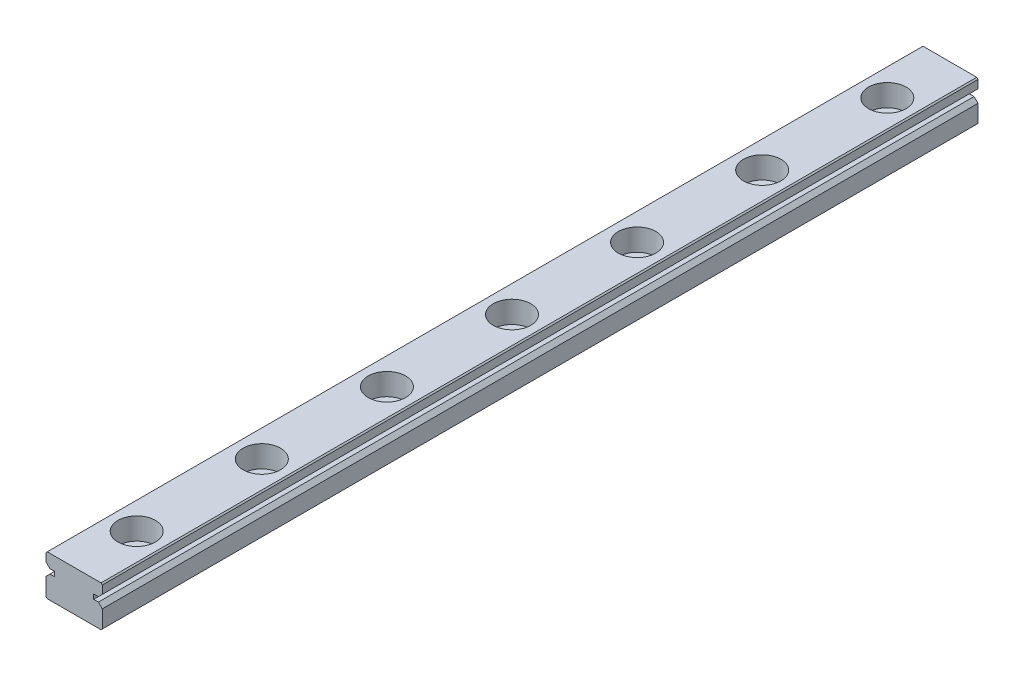
ISO-10303-21;
HEADER;
FILE_DESCRIPTION(('STEP AP214'),'2;1');
FILE_NAME('part.step','',(''),(''),'','','');
FILE_SCHEMA(('AUTOMOTIVE_DESIGN { 1 0 10303 214 1 1 1 1 }'));
ENDSEC;
DATA;
#1=APPLICATION_CONTEXT('core data for automotive mechanical design processes');
#2=APPLICATION_PROTOCOL_DEFINITION('international standard','automotive_design',2000,#1);
#3=PRODUCT_CONTEXT('',#1,'mechanical');
#4=PRODUCT('Part','Part','',(#3));
#5=PRODUCT_RELATED_PRODUCT_CATEGORY('part','',(#4));
#6=PRODUCT_DEFINITION_FORMATION('','',#4);
#7=PRODUCT_DEFINITION_CONTEXT('part definition',#1,'design');
#8=PRODUCT_DEFINITION('design','',#6,#7);
#9=PRODUCT_DEFINITION_SHAPE('','',#8);
#10=(LENGTH_UNIT() NAMED_UNIT(*) SI_UNIT(.MILLI.,.METRE.));
#11=(NAMED_UNIT(*) PLANE_ANGLE_UNIT() SI_UNIT($,.RADIAN.));
#12=(NAMED_UNIT(*) SI_UNIT($,.STERADIAN.) SOLID_ANGLE_UNIT());
#13=UNCERTAINTY_MEASURE_WITH_UNIT(LENGTH_MEASURE(1.E-05),#10,'distance_accuracy_value','');
#14=(GEOMETRIC_REPRESENTATION_CONTEXT(3) GLOBAL_UNCERTAINTY_ASSIGNED_CONTEXT((#13)) GLOBAL_UNIT_ASSIGNED_CONTEXT((#10,
#11,#12)) REPRESENTATION_CONTEXT('',''));
#15=CARTESIAN_POINT('',(0.,0.,0.));
#16=DIRECTION('',(0.,0.,1.));
#17=DIRECTION('',(1.,0.,0.));
#18=AXIS2_PLACEMENT_3D('',#15,#16,#17);
#19=CARTESIAN_POINT('',(0.,6.5,130.));
#20=DIRECTION('',(0.,1.,0.));
#21=DIRECTION('',(0.,0.,1.));
#22=AXIS2_PLACEMENT_3D('',#19,#20,#21);
#23=CYLINDRICAL_SURFACE('',#22,3.);
#24=CARTESIAN_POINT('',(0.,3.,130.));
#25=DIRECTION('',(0.,1.,0.));
#26=DIRECTION('',(0.,0.,1.));
#27=AXIS2_PLACEMENT_3D('',#24,#25,#26);
#28=CIRCLE('',#27,3.);
#29=CARTESIAN_POINT('',(0.,3.,133.));
#30=VERTEX_POINT('',#29);
#31=EDGE_CURVE('E11',#30,#30,#28,.T.);
#32=ORIENTED_EDGE('',*,*,#31,.F.);
#33=EDGE_LOOP('',(#32));
#34=FACE_BOUND('',#33,.T.);
#35=CARTESIAN_POINT('',(0.,6.5,130.));
#36=DIRECTION('',(0.,1.,0.));
#37=DIRECTION('',(0.,0.,1.));
#38=AXIS2_PLACEMENT_3D('',#35,#36,#37);
#39=CIRCLE('',#38,3.);
#40=CARTESIAN_POINT('',(0.,6.5,133.));
#41=VERTEX_POINT('',#40);
#42=EDGE_CURVE('E354',#41,#41,#39,.T.);
#43=ORIENTED_EDGE('',*,*,#42,.T.);
#44=EDGE_LOOP('',(#43));
#45=FACE_BOUND('',#44,.T.);
#46=ADVANCED_FACE('F47',(#34,#45),#23,.F.);
#47=CARTESIAN_POINT('',(1.75,3.,130.));
#48=DIRECTION('',(0.,-1.,0.));
#49=DIRECTION('',(0.,0.,-1.));
#50=AXIS2_PLACEMENT_3D('',#47,#48,#49);
#51=PLANE('',#50);
#52=CARTESIAN_POINT('',(0.,3.,130.));
#53=DIRECTION('',(0.,1.,0.));
#54=DIRECTION('',(0.,0.,1.));
#55=AXIS2_PLACEMENT_3D('',#52,#53,#54);
#56=CIRCLE('',#55,1.75);
#57=CARTESIAN_POINT('',(0.,3.,131.75));
#58=VERTEX_POINT('',#57);
#59=EDGE_CURVE('E55',#58,#58,#56,.T.);
#60=ORIENTED_EDGE('',*,*,#59,.F.);
#61=EDGE_LOOP('',(#60));
#62=FACE_BOUND('',#61,.T.);
#63=ORIENTED_EDGE('',*,*,#31,.T.);
#64=EDGE_LOOP('',(#63));
#65=FACE_BOUND('',#64,.T.);
#66=ADVANCED_FACE('F364',(#62,#65),#51,.F.);
#67=CARTESIAN_POINT('',(0.,6.5,130.));
#68=DIRECTION('',(0.,1.,0.));
#69=DIRECTION('',(0.,0.,1.));
#70=AXIS2_PLACEMENT_3D('',#67,#68,#69);
#71=CYLINDRICAL_SURFACE('',#70,1.75);
#72=CARTESIAN_POINT('',(0.,0.,130.));
#73=DIRECTION('',(0.,1.,0.));
#74=DIRECTION('',(0.,0.,1.));
#75=AXIS2_PLACEMENT_3D('',#72,#73,#74);
#76=CIRCLE('',#75,1.75);
#77=CARTESIAN_POINT('',(0.,0.,131.75));
#78=VERTEX_POINT('',#77);
#79=EDGE_CURVE('E357',#78,#78,#76,.T.);
#80=ORIENTED_EDGE('',*,*,#79,.F.);
#81=EDGE_LOOP('',(#80));
#82=FACE_BOUND('',#81,.T.);
#83=ORIENTED_EDGE('',*,*,#59,.T.);
#84=EDGE_LOOP('',(#83));
#85=FACE_BOUND('',#84,.T.);
#86=ADVANCED_FACE('F362',(#82,#85),#71,.F.);
#87=CARTESIAN_POINT('',(0.,6.5,110.));
#88=DIRECTION('',(0.,1.,0.));
#89=DIRECTION('',(0.,0.,1.));
#90=AXIS2_PLACEMENT_3D('',#87,#88,#89);
#91=CYLINDRICAL_SURFACE('',#90,3.);
#92=CARTESIAN_POINT('',(0.,3.,110.));
#93=DIRECTION('',(0.,1.,0.));
#94=DIRECTION('',(0.,0.,1.));
#95=AXIS2_PLACEMENT_3D('',#92,#93,#94);
#96=CIRCLE('',#95,3.);
#97=CARTESIAN_POINT('',(0.,3.,113.));
#98=VERTEX_POINT('',#97);
#99=EDGE_CURVE('E351',#98,#98,#96,.T.);
#100=ORIENTED_EDGE('',*,*,#99,.F.);
#101=EDGE_LOOP('',(#100));
#102=FACE_BOUND('',#101,.T.);
#103=CARTESIAN_POINT('',(0.,6.5,110.));
#104=DIRECTION('',(0.,1.,0.));
#105=DIRECTION('',(0.,0.,1.));
#106=AXIS2_PLACEMENT_3D('',#103,#104,#105);
#107=CIRCLE('',#106,3.);
#108=CARTESIAN_POINT('',(0.,6.5,113.));
#109=VERTEX_POINT('',#108);
#110=EDGE_CURVE('E342',#109,#109,#107,.T.);
#111=ORIENTED_EDGE('',*,*,#110,.T.);
#112=EDGE_LOOP('',(#111));
#113=FACE_BOUND('',#112,.T.);
#114=ADVANCED_FACE('F471',(#102,#113),#91,.F.);
#115=CARTESIAN_POINT('',(1.75,3.,110.));
#116=DIRECTION('',(0.,-1.,0.));
#117=DIRECTION('',(0.,0.,-1.));
#118=AXIS2_PLACEMENT_3D('',#115,#116,#117);
#119=PLANE('',#118);
#120=CARTESIAN_POINT('',(0.,3.,110.));
#121=DIRECTION('',(0.,1.,0.));
#122=DIRECTION('',(0.,0.,1.));
#123=AXIS2_PLACEMENT_3D('',#120,#121,#122);
#124=CIRCLE('',#123,1.75);
#125=CARTESIAN_POINT('',(0.,3.,111.75));
#126=VERTEX_POINT('',#125);
#127=EDGE_CURVE('E348',#126,#126,#124,.T.);
#128=ORIENTED_EDGE('',*,*,#127,.F.);
#129=EDGE_LOOP('',(#128));
#130=FACE_BOUND('',#129,.T.);
#131=ORIENTED_EDGE('',*,*,#99,.T.);
#132=EDGE_LOOP('',(#131));
#133=FACE_BOUND('',#132,.T.);
#134=ADVANCED_FACE('F467',(#130,#133),#119,.F.);
#135=CARTESIAN_POINT('',(0.,6.5,110.));
#136=DIRECTION('',(0.,1.,0.));
#137=DIRECTION('',(0.,0.,1.));
#138=AXIS2_PLACEMENT_3D('',#135,#136,#137);
#139=CYLINDRICAL_SURFACE('',#138,1.75);
#140=CARTESIAN_POINT('',(0.,0.,110.));
#141=DIRECTION('',(0.,1.,0.));
#142=DIRECTION('',(0.,0.,1.));
#143=AXIS2_PLACEMENT_3D('',#140,#141,#142);
#144=CIRCLE('',#143,1.75);
#145=CARTESIAN_POINT('',(0.,0.,111.75));
#146=VERTEX_POINT('',#145);
#147=EDGE_CURVE('E345',#146,#146,#144,.T.);
#148=ORIENTED_EDGE('',*,*,#147,.F.);
#149=EDGE_LOOP('',(#148));
#150=FACE_BOUND('',#149,.T.);
#151=ORIENTED_EDGE('',*,*,#127,.T.);
#152=EDGE_LOOP('',(#151));
#153=FACE_BOUND('',#152,.T.);
#154=ADVANCED_FACE('F463',(#150,#153),#139,.F.);
#155=CARTESIAN_POINT('',(0.,6.5,90.));
#156=DIRECTION('',(0.,1.,0.));
#157=DIRECTION('',(0.,0.,1.));
#158=AXIS2_PLACEMENT_3D('',#155,#156,#157);
#159=CYLINDRICAL_SURFACE('',#158,3.);
#160=CARTESIAN_POINT('',(0.,3.,90.));
#161=DIRECTION('',(0.,1.,0.));
#162=DIRECTION('',(0.,0.,1.));
#163=AXIS2_PLACEMENT_3D('',#160,#161,#162);
#164=CIRCLE('',#163,3.);
#165=CARTESIAN_POINT('',(0.,3.,93.));
#166=VERTEX_POINT('',#165);
#167=EDGE_CURVE('E339',#166,#166,#164,.T.);
#168=ORIENTED_EDGE('',*,*,#167,.F.);
#169=EDGE_LOOP('',(#168));
#170=FACE_BOUND('',#169,.T.);
#171=CARTESIAN_POINT('',(0.,6.5,90.));
#172=DIRECTION('',(0.,1.,0.));
#173=DIRECTION('',(0.,0.,1.));
#174=AXIS2_PLACEMENT_3D('',#171,#172,#173);
#175=CIRCLE('',#174,3.);
#176=CARTESIAN_POINT('',(0.,6.5,93.));
#177=VERTEX_POINT('',#176);
#178=EDGE_CURVE('E330',#177,#177,#175,.T.);
#179=ORIENTED_EDGE('',*,*,#178,.T.);
#180=EDGE_LOOP('',(#179));
#181=FACE_BOUND('',#180,.T.);
#182=ADVANCED_FACE('F459',(#170,#181),#159,.F.);
#183=CARTESIAN_POINT('',(1.75,3.,90.));
#184=DIRECTION('',(0.,-1.,0.));
#185=DIRECTION('',(0.,0.,-1.));
#186=AXIS2_PLACEMENT_3D('',#183,#184,#185);
#187=PLANE('',#186);
#188=CARTESIAN_POINT('',(0.,3.,90.));
#189=DIRECTION('',(0.,1.,0.));
#190=DIRECTION('',(0.,0.,1.));
#191=AXIS2_PLACEMENT_3D('',#188,#189,#190);
#192=CIRCLE('',#191,1.75);
#193=CARTESIAN_POINT('',(0.,3.,91.75));
#194=VERTEX_POINT('',#193);
#195=EDGE_CURVE('E336',#194,#194,#192,.T.);
#196=ORIENTED_EDGE('',*,*,#195,.F.);
#197=EDGE_LOOP('',(#196));
#198=FACE_BOUND('',#197,.T.);
#199=ORIENTED_EDGE('',*,*,#167,.T.);
#200=EDGE_LOOP('',(#199));
#201=FACE_BOUND('',#200,.T.);
#202=ADVANCED_FACE('F455',(#198,#201),#187,.F.);
#203=CARTESIAN_POINT('',(0.,6.5,90.));
#204=DIRECTION('',(0.,1.,0.));
#205=DIRECTION('',(0.,0.,1.));
#206=AXIS2_PLACEMENT_3D('',#203,#204,#205);
#207=CYLINDRICAL_SURFACE('',#206,1.75);
#208=CARTESIAN_POINT('',(0.,0.,90.));
#209=DIRECTION('',(0.,1.,0.));
#210=DIRECTION('',(0.,0.,1.));
#211=AXIS2_PLACEMENT_3D('',#208,#209,#210);
#212=CIRCLE('',#211,1.75);
#213=CARTESIAN_POINT('',(0.,0.,91.75));
#214=VERTEX_POINT('',#213);
#215=EDGE_CURVE('E333',#214,#214,#212,.T.);
#216=ORIENTED_EDGE('',*,*,#215,.F.);
#217=EDGE_LOOP('',(#216));
#218=FACE_BOUND('',#217,.T.);
#219=ORIENTED_EDGE('',*,*,#195,.T.);
#220=EDGE_LOOP('',(#219));
#221=FACE_BOUND('',#220,.T.);
#222=ADVANCED_FACE('F451',(#218,#221),#207,.F.);
#223=CARTESIAN_POINT('',(0.,6.5,70.));
#224=DIRECTION('',(0.,1.,0.));
#225=DIRECTION('',(0.,0.,1.));
#226=AXIS2_PLACEMENT_3D('',#223,#224,#225);
#227=CYLINDRICAL_SURFACE('',#226,3.);
#228=CARTESIAN_POINT('',(0.,3.,70.));
#229=DIRECTION('',(0.,1.,0.));
#230=DIRECTION('',(0.,0.,1.));
#231=AXIS2_PLACEMENT_3D('',#228,#229,#230);
#232=CIRCLE('',#231,3.);
#233=CARTESIAN_POINT('',(0.,3.,73.));
#234=VERTEX_POINT('',#233);
#235=EDGE_CURVE('E327',#234,#234,#232,.T.);
#236=ORIENTED_EDGE('',*,*,#235,.F.);
#237=EDGE_LOOP('',(#236));
#238=FACE_BOUND('',#237,.T.);
#239=CARTESIAN_POINT('',(0.,6.5,70.));
#240=DIRECTION('',(0.,1.,0.));
#241=DIRECTION('',(0.,0.,1.));
#242=AXIS2_PLACEMENT_3D('',#239,#240,#241);
#243=CIRCLE('',#242,3.);
#244=CARTESIAN_POINT('',(0.,6.5,73.));
#245=VERTEX_POINT('',#244);
#246=EDGE_CURVE('E318',#245,#245,#243,.T.);
#247=ORIENTED_EDGE('',*,*,#246,.T.);
#248=EDGE_LOOP('',(#247));
#249=FACE_BOUND('',#248,.T.);
#250=ADVANCED_FACE('F447',(#238,#249),#227,.F.);
#251=CARTESIAN_POINT('',(1.75,3.,70.));
#252=DIRECTION('',(0.,-1.,0.));
#253=DIRECTION('',(0.,0.,-1.));
#254=AXIS2_PLACEMENT_3D('',#251,#252,#253);
#255=PLANE('',#254);
#256=CARTESIAN_POINT('',(0.,3.,70.));
#257=DIRECTION('',(0.,1.,0.));
#258=DIRECTION('',(0.,0.,1.));
#259=AXIS2_PLACEMENT_3D('',#256,#257,#258);
#260=CIRCLE('',#259,1.75);
#261=CARTESIAN_POINT('',(0.,3.,71.75));
#262=VERTEX_POINT('',#261);
#263=EDGE_CURVE('E324',#262,#262,#260,.T.);
#264=ORIENTED_EDGE('',*,*,#263,.F.);
#265=EDGE_LOOP('',(#264));
#266=FACE_BOUND('',#265,.T.);
#267=ORIENTED_EDGE('',*,*,#235,.T.);
#268=EDGE_LOOP('',(#267));
#269=FACE_BOUND('',#268,.T.);
#270=ADVANCED_FACE('F443',(#266,#269),#255,.F.);
#271=CARTESIAN_POINT('',(0.,6.5,70.));
#272=DIRECTION('',(0.,1.,0.));
#273=DIRECTION('',(0.,0.,1.));
#274=AXIS2_PLACEMENT_3D('',#271,#272,#273);
#275=CYLINDRICAL_SURFACE('',#274,1.75);
#276=CARTESIAN_POINT('',(0.,0.,70.));
#277=DIRECTION('',(0.,1.,0.));
#278=DIRECTION('',(0.,0.,1.));
#279=AXIS2_PLACEMENT_3D('',#276,#277,#278);
#280=CIRCLE('',#279,1.75);
#281=CARTESIAN_POINT('',(0.,0.,71.75));
#282=VERTEX_POINT('',#281);
#283=EDGE_CURVE('E321',#282,#282,#280,.T.);
#284=ORIENTED_EDGE('',*,*,#283,.F.);
#285=EDGE_LOOP('',(#284));
#286=FACE_BOUND('',#285,.T.);
#287=ORIENTED_EDGE('',*,*,#263,.T.);
#288=EDGE_LOOP('',(#287));
#289=FACE_BOUND('',#288,.T.);
#290=ADVANCED_FACE('F439',(#286,#289),#275,.F.);
#291=CARTESIAN_POINT('',(0.,6.5,50.));
#292=DIRECTION('',(0.,1.,0.));
#293=DIRECTION('',(0.,0.,1.));
#294=AXIS2_PLACEMENT_3D('',#291,#292,#293);
#295=CYLINDRICAL_SURFACE('',#294,3.);
#296=CARTESIAN_POINT('',(0.,3.,50.));
#297=DIRECTION('',(0.,1.,0.));
#298=DIRECTION('',(0.,0.,1.));
#299=AXIS2_PLACEMENT_3D('',#296,#297,#298);
#300=CIRCLE('',#299,3.);
#301=CARTESIAN_POINT('',(0.,3.,53.));
#302=VERTEX_POINT('',#301);
#303=EDGE_CURVE('E315',#302,#302,#300,.T.);
#304=ORIENTED_EDGE('',*,*,#303,.F.);
#305=EDGE_LOOP('',(#304));
#306=FACE_BOUND('',#305,.T.);
#307=CARTESIAN_POINT('',(0.,6.5,50.));
#308=DIRECTION('',(0.,1.,0.));
#309=DIRECTION('',(0.,0.,1.));
#310=AXIS2_PLACEMENT_3D('',#307,#308,#309);
#311=CIRCLE('',#310,3.);
#312=CARTESIAN_POINT('',(0.,6.5,53.));
#313=VERTEX_POINT('',#312);
#314=EDGE_CURVE('E306',#313,#313,#311,.T.);
#315=ORIENTED_EDGE('',*,*,#314,.T.);
#316=EDGE_LOOP('',(#315));
#317=FACE_BOUND('',#316,.T.);
#318=ADVANCED_FACE('F435',(#306,#317),#295,.F.);
#319=CARTESIAN_POINT('',(1.75,3.,50.));
#320=DIRECTION('',(0.,-1.,0.));
#321=DIRECTION('',(0.,0.,-1.));
#322=AXIS2_PLACEMENT_3D('',#319,#320,#321);
#323=PLANE('',#322);
#324=CARTESIAN_POINT('',(0.,3.,50.));
#325=DIRECTION('',(0.,1.,0.));
#326=DIRECTION('',(0.,0.,1.));
#327=AXIS2_PLACEMENT_3D('',#324,#325,#326);
#328=CIRCLE('',#327,1.75);
#329=CARTESIAN_POINT('',(0.,3.,51.75));
#330=VERTEX_POINT('',#329);
#331=EDGE_CURVE('E312',#330,#330,#328,.T.);
#332=ORIENTED_EDGE('',*,*,#331,.F.);
#333=EDGE_LOOP('',(#332));
#334=FACE_BOUND('',#333,.T.);
#335=ORIENTED_EDGE('',*,*,#303,.T.);
#336=EDGE_LOOP('',(#335));
#337=FACE_BOUND('',#336,.T.);
#338=ADVANCED_FACE('F431',(#334,#337),#323,.F.);
#339=CARTESIAN_POINT('',(0.,6.5,50.));
#340=DIRECTION('',(0.,1.,0.));
#341=DIRECTION('',(0.,0.,1.));
#342=AXIS2_PLACEMENT_3D('',#339,#340,#341);
#343=CYLINDRICAL_SURFACE('',#342,1.75);
#344=CARTESIAN_POINT('',(0.,0.,50.));
#345=DIRECTION('',(0.,1.,0.));
#346=DIRECTION('',(0.,0.,1.));
#347=AXIS2_PLACEMENT_3D('',#344,#345,#346);
#348=CIRCLE('',#347,1.75);
#349=CARTESIAN_POINT('',(0.,0.,51.75));
#350=VERTEX_POINT('',#349);
#351=EDGE_CURVE('E309',#350,#350,#348,.T.);
#352=ORIENTED_EDGE('',*,*,#351,.F.);
#353=EDGE_LOOP('',(#352));
#354=FACE_BOUND('',#353,.T.);
#355=ORIENTED_EDGE('',*,*,#331,.T.);
#356=EDGE_LOOP('',(#355));
#357=FACE_BOUND('',#356,.T.);
#358=ADVANCED_FACE('F427',(#354,#357),#343,.F.);
#359=CARTESIAN_POINT('',(-4.30000000000002,0.,140.));
#360=DIRECTION('',(0.,1.,0.));
#361=DIRECTION('',(0.,0.,1.));
#362=AXIS2_PLACEMENT_3D('',#359,#360,#361);
#363=PLANE('',#362);
#364=CARTESIAN_POINT('',(0.,0.,30.));
#365=DIRECTION('',(0.,1.,0.));
#366=DIRECTION('',(0.,0.,1.));
#367=AXIS2_PLACEMENT_3D('',#364,#365,#366);
#368=CIRCLE('',#367,1.75);
#369=CARTESIAN_POINT('',(0.,0.,31.75));
#370=VERTEX_POINT('',#369);
#371=EDGE_CURVE('E795',#370,#370,#368,.T.);
#372=ORIENTED_EDGE('',*,*,#371,.T.);
#373=EDGE_LOOP('',(#372));
#374=FACE_BOUND('',#373,.T.);
#375=CARTESIAN_POINT('',(0.,0.,10.));
#376=DIRECTION('',(0.,1.,0.));
#377=DIRECTION('',(0.,0.,1.));
#378=AXIS2_PLACEMENT_3D('',#375,#376,#377);
#379=CIRCLE('',#378,1.75);
#380=CARTESIAN_POINT('',(0.,0.,11.75));
#381=VERTEX_POINT('',#380);
#382=EDGE_CURVE('E220',#381,#381,#379,.T.);
#383=ORIENTED_EDGE('',*,*,#382,.T.);
#384=EDGE_LOOP('',(#383));
#385=FACE_BOUND('',#384,.T.);
#386=DIRECTION('',(1.,0.,0.));
#387=VECTOR('',#386,1.);
#388=CARTESIAN_POINT('',(-4.30000000000002,0.,0.));
#389=LINE('',#388,#387);
#390=CARTESIAN_POINT('',(-4.30000000000002,0.,0.));
#391=VERTEX_POINT('',#390);
#392=CARTESIAN_POINT('',(4.30000000000002,0.,0.));
#393=VERTEX_POINT('',#392);
#394=EDGE_CURVE('E216',#391,#393,#389,.T.);
#395=ORIENTED_EDGE('',*,*,#394,.T.);
#396=DIRECTION('',(0.,0.,-1.));
#397=VECTOR('',#396,1.);
#398=CARTESIAN_POINT('',(4.30000000000002,0.,140.));
#399=LINE('',#398,#397);
#400=CARTESIAN_POINT('',(4.30000000000002,0.,140.));
#401=VERTEX_POINT('',#400);
#402=EDGE_CURVE('E304',#401,#393,#399,.T.);
#403=ORIENTED_EDGE('',*,*,#402,.F.);
#404=DIRECTION('',(1.,0.,0.));
#405=VECTOR('',#404,1.);
#406=CARTESIAN_POINT('',(-4.30000000000002,0.,140.));
#407=LINE('',#406,#405);
#408=CARTESIAN_POINT('',(-4.30000000000002,0.,140.));
#409=VERTEX_POINT('',#408);
#410=EDGE_CURVE('E255',#409,#401,#407,.T.);
#411=ORIENTED_EDGE('',*,*,#410,.F.);
#412=DIRECTION('',(0.,0.,-1.));
#413=VECTOR('',#412,1.);
#414=CARTESIAN_POINT('',(-4.30000000000002,0.,140.));
#415=LINE('',#414,#413);
#416=EDGE_CURVE('E212',#409,#391,#415,.T.);
#417=ORIENTED_EDGE('',*,*,#416,.T.);
#418=EDGE_LOOP('',(#395,#403,#411,#417));
#419=FACE_BOUND('',#418,.T.);
#420=ORIENTED_EDGE('',*,*,#351,.T.);
#421=EDGE_LOOP('',(#420));
#422=FACE_BOUND('',#421,.T.);
#423=ORIENTED_EDGE('',*,*,#283,.T.);
#424=EDGE_LOOP('',(#423));
#425=FACE_BOUND('',#424,.T.);
#426=ORIENTED_EDGE('',*,*,#215,.T.);
#427=EDGE_LOOP('',(#426));
#428=FACE_BOUND('',#427,.T.);
#429=ORIENTED_EDGE('',*,*,#147,.T.);
#430=EDGE_LOOP('',(#429));
#431=FACE_BOUND('',#430,.T.);
#432=ORIENTED_EDGE('',*,*,#79,.T.);
#433=EDGE_LOOP('',(#432));
#434=FACE_BOUND('',#433,.T.);
#435=ADVANCED_FACE('F425',(#374,#385,#419,#422,#425,#428,#431,#434),#363,.F.);
#436=CARTESIAN_POINT('',(4.30000000000002,0.,140.));
#437=DIRECTION('',(-0.707106781186548,0.707106781186548,0.));
#438=DIRECTION('',(-0.707106781186548,-0.707106781186548,0.));
#439=AXIS2_PLACEMENT_3D('',#436,#437,#438);
#440=PLANE('',#439);
#441=DIRECTION('',(0.707106781186548,0.707106781186548,0.));
#442=VECTOR('',#441,1.);
#443=CARTESIAN_POINT('',(4.30000000000002,0.,0.));
#444=LINE('',#443,#442);
#445=CARTESIAN_POINT('',(4.5,0.199999999999978,0.));
#446=VERTEX_POINT('',#445);
#447=EDGE_CURVE('E219',#393,#446,#444,.T.);
#448=ORIENTED_EDGE('',*,*,#447,.T.);
#449=DIRECTION('',(0.,0.,-1.));
#450=VECTOR('',#449,1.);
#451=CARTESIAN_POINT('',(4.5,0.199999999999978,140.));
#452=LINE('',#451,#450);
#453=CARTESIAN_POINT('',(4.5,0.199999999999978,140.));
#454=VERTEX_POINT('',#453);
#455=EDGE_CURVE('E301',#454,#446,#452,.T.);
#456=ORIENTED_EDGE('',*,*,#455,.F.);
#457=DIRECTION('',(0.707106781186548,0.707106781186548,0.));
#458=VECTOR('',#457,1.);
#459=CARTESIAN_POINT('',(4.30000000000002,0.,140.));
#460=LINE('',#459,#458);
#461=EDGE_CURVE('E143',#401,#454,#460,.T.);
#462=ORIENTED_EDGE('',*,*,#461,.F.);
#463=ORIENTED_EDGE('',*,*,#402,.T.);
#464=EDGE_LOOP('',(#448,#456,#462,#463));
#465=FACE_BOUND('',#464,.T.);
#466=ADVANCED_FACE('F421',(#465),#440,.F.);
#467=CARTESIAN_POINT('',(4.5,0.199999999999978,140.));
#468=DIRECTION('',(-1.,0.,0.));
#469=DIRECTION('',(0.,0.,1.));
#470=AXIS2_PLACEMENT_3D('',#467,#468,#469);
#471=PLANE('',#470);
#472=DIRECTION('',(0.,1.,0.));
#473=VECTOR('',#472,1.);
#474=CARTESIAN_POINT('',(4.5,0.199999999999978,0.));
#475=LINE('',#474,#473);
#476=CARTESIAN_POINT('',(4.5,3.,0.));
#477=VERTEX_POINT('',#476);
#478=EDGE_CURVE('E222',#446,#477,#475,.T.);
#479=ORIENTED_EDGE('',*,*,#478,.T.);
#480=DIRECTION('',(0.,0.,-1.));
#481=VECTOR('',#480,1.);
#482=CARTESIAN_POINT('',(4.5,3.,140.));
#483=LINE('',#482,#481);
#484=CARTESIAN_POINT('',(4.5,3.,140.));
#485=VERTEX_POINT('',#484);
#486=EDGE_CURVE('E298',#485,#477,#483,.T.);
#487=ORIENTED_EDGE('',*,*,#486,.F.);
#488=DIRECTION('',(0.,1.,0.));
#489=VECTOR('',#488,1.);
#490=CARTESIAN_POINT('',(4.5,0.199999999999978,140.));
#491=LINE('',#490,#489);
#492=EDGE_CURVE('E818',#454,#485,#491,.T.);
#493=ORIENTED_EDGE('',*,*,#492,.F.);
#494=ORIENTED_EDGE('',*,*,#455,.T.);
#495=EDGE_LOOP('',(#479,#487,#493,#494));
#496=FACE_BOUND('',#495,.T.);
#497=ADVANCED_FACE('F417',(#496),#471,.F.);
#498=CARTESIAN_POINT('',(4.5,3.,140.));
#499=DIRECTION('',(-0.707106781186548,-0.707106781186547,0.));
#500=DIRECTION('',(0.707106781186547,-0.707106781186548,0.));
#501=AXIS2_PLACEMENT_3D('',#498,#499,#500);
#502=PLANE('',#501);
#503=DIRECTION('',(-0.707106781186547,0.707106781186548,0.));
#504=VECTOR('',#503,1.);
#505=CARTESIAN_POINT('',(4.5,3.,0.));
#506=LINE('',#505,#504);
#507=CARTESIAN_POINT('',(3.875,3.625,0.));
#508=VERTEX_POINT('',#507);
#509=EDGE_CURVE('E224',#477,#508,#506,.T.);
#510=ORIENTED_EDGE('',*,*,#509,.T.);
#511=DIRECTION('',(0.,0.,-1.));
#512=VECTOR('',#511,1.);
#513=CARTESIAN_POINT('',(3.875,3.625,140.));
#514=LINE('',#513,#512);
#515=CARTESIAN_POINT('',(3.875,3.625,140.));
#516=VERTEX_POINT('',#515);
#517=EDGE_CURVE('E295',#516,#508,#514,.T.);
#518=ORIENTED_EDGE('',*,*,#517,.F.);
#519=DIRECTION('',(-0.707106781186547,0.707106781186548,0.));
#520=VECTOR('',#519,1.);
#521=CARTESIAN_POINT('',(4.5,3.,140.));
#522=LINE('',#521,#520);
#523=EDGE_CURVE('E820',#485,#516,#522,.T.);
#524=ORIENTED_EDGE('',*,*,#523,.F.);
#525=ORIENTED_EDGE('',*,*,#486,.T.);
#526=EDGE_LOOP('',(#510,#518,#524,#525));
#527=FACE_BOUND('',#526,.T.);
#528=ADVANCED_FACE('F413',(#527),#502,.F.);
#529=CARTESIAN_POINT('',(3.875,3.625,140.));
#530=DIRECTION('',(0.,-1.,0.));
#531=DIRECTION('',(0.,0.,-1.));
#532=AXIS2_PLACEMENT_3D('',#529,#530,#531);
#533=PLANE('',#532);
#534=DIRECTION('',(-1.,0.,0.));
#535=VECTOR('',#534,1.);
#536=CARTESIAN_POINT('',(3.875,3.625,0.));
#537=LINE('',#536,#535);
#538=CARTESIAN_POINT('',(3.125,3.625,0.));
#539=VERTEX_POINT('',#538);
#540=EDGE_CURVE('E226',#508,#539,#537,.T.);
#541=ORIENTED_EDGE('',*,*,#540,.T.);
#542=DIRECTION('',(0.,0.,-1.));
#543=VECTOR('',#542,1.);
#544=CARTESIAN_POINT('',(3.125,3.625,140.));
#545=LINE('',#544,#543);
#546=CARTESIAN_POINT('',(3.125,3.625,140.));
#547=VERTEX_POINT('',#546);
#548=EDGE_CURVE('E292',#547,#539,#545,.T.);
#549=ORIENTED_EDGE('',*,*,#548,.F.);
#550=DIRECTION('',(-1.,0.,0.));
#551=VECTOR('',#550,1.);
#552=CARTESIAN_POINT('',(3.875,3.625,140.));
#553=LINE('',#552,#551);
#554=EDGE_CURVE('E822',#516,#547,#553,.T.);
#555=ORIENTED_EDGE('',*,*,#554,.F.);
#556=ORIENTED_EDGE('',*,*,#517,.T.);
#557=EDGE_LOOP('',(#541,#549,#555,#556));
#558=FACE_BOUND('',#557,.T.);
#559=ADVANCED_FACE('F409',(#558),#533,.F.);
#560=CARTESIAN_POINT('',(3.125,3.625,140.));
#561=DIRECTION('',(-1.,0.,0.));
#562=DIRECTION('',(0.,0.,1.));
#563=AXIS2_PLACEMENT_3D('',#560,#561,#562);
#564=PLANE('',#563);
#565=DIRECTION('',(0.,1.,0.));
#566=VECTOR('',#565,1.);
#567=CARTESIAN_POINT('',(3.125,3.625,0.));
#568=LINE('',#567,#566);
#569=CARTESIAN_POINT('',(3.125,4.375,0.));
#570=VERTEX_POINT('',#569);
#571=EDGE_CURVE('E228',#539,#570,#568,.T.);
#572=ORIENTED_EDGE('',*,*,#571,.T.);
#573=DIRECTION('',(0.,0.,-1.));
#574=VECTOR('',#573,1.);
#575=CARTESIAN_POINT('',(3.125,4.375,140.));
#576=LINE('',#575,#574);
#577=CARTESIAN_POINT('',(3.125,4.375,140.));
#578=VERTEX_POINT('',#577);
#579=EDGE_CURVE('E289',#578,#570,#576,.T.);
#580=ORIENTED_EDGE('',*,*,#579,.F.);
#581=DIRECTION('',(0.,1.,0.));
#582=VECTOR('',#581,1.);
#583=CARTESIAN_POINT('',(3.125,3.625,140.));
#584=LINE('',#583,#582);
#585=EDGE_CURVE('E824',#547,#578,#584,.T.);
#586=ORIENTED_EDGE('',*,*,#585,.F.);
#587=ORIENTED_EDGE('',*,*,#548,.T.);
#588=EDGE_LOOP('',(#572,#580,#586,#587));
#589=FACE_BOUND('',#588,.T.);
#590=ADVANCED_FACE('F405',(#589),#564,.F.);
#591=CARTESIAN_POINT('',(3.125,4.375,140.));
#592=DIRECTION('',(0.,1.,0.));
#593=DIRECTION('',(0.,0.,1.));
#594=AXIS2_PLACEMENT_3D('',#591,#592,#593);
#595=PLANE('',#594);
#596=DIRECTION('',(1.,0.,0.));
#597=VECTOR('',#596,1.);
#598=CARTESIAN_POINT('',(3.125,4.375,0.));
#599=LINE('',#598,#597);
#600=CARTESIAN_POINT('',(3.875,4.375,0.));
#601=VERTEX_POINT('',#600);
#602=EDGE_CURVE('E230',#570,#601,#599,.T.);
#603=ORIENTED_EDGE('',*,*,#602,.T.);
#604=DIRECTION('',(0.,0.,-1.));
#605=VECTOR('',#604,1.);
#606=CARTESIAN_POINT('',(3.875,4.375,140.));
#607=LINE('',#606,#605);
#608=CARTESIAN_POINT('',(3.875,4.375,140.));
#609=VERTEX_POINT('',#608);
#610=EDGE_CURVE('E286',#609,#601,#607,.T.);
#611=ORIENTED_EDGE('',*,*,#610,.F.);
#612=DIRECTION('',(1.,0.,0.));
#613=VECTOR('',#612,1.);
#614=CARTESIAN_POINT('',(3.125,4.375,140.));
#615=LINE('',#614,#613);
#616=EDGE_CURVE('E826',#578,#609,#615,.T.);
#617=ORIENTED_EDGE('',*,*,#616,.F.);
#618=ORIENTED_EDGE('',*,*,#579,.T.);
#619=EDGE_LOOP('',(#603,#611,#617,#618));
#620=FACE_BOUND('',#619,.T.);
#621=ADVANCED_FACE('F401',(#620),#595,.F.);
#622=CARTESIAN_POINT('',(3.875,4.375,140.));
#623=DIRECTION('',(-0.707106781186548,0.707106781186548,0.));
#624=DIRECTION('',(-0.707106781186548,-0.707106781186548,0.));
#625=AXIS2_PLACEMENT_3D('',#622,#623,#624);
#626=PLANE('',#625);
#627=DIRECTION('',(0.707106781186547,0.707106781186547,0.));
#628=VECTOR('',#627,1.);
#629=CARTESIAN_POINT('',(3.875,4.375,0.));
#630=LINE('',#629,#628);
#631=CARTESIAN_POINT('',(4.5,5.,0.));
#632=VERTEX_POINT('',#631);
#633=EDGE_CURVE('E232',#601,#632,#630,.T.);
#634=ORIENTED_EDGE('',*,*,#633,.T.);
#635=DIRECTION('',(0.,0.,-1.));
#636=VECTOR('',#635,1.);
#637=CARTESIAN_POINT('',(4.5,5.,140.));
#638=LINE('',#637,#636);
#639=CARTESIAN_POINT('',(4.5,5.,140.));
#640=VERTEX_POINT('',#639);
#641=EDGE_CURVE('E283',#640,#632,#638,.T.);
#642=ORIENTED_EDGE('',*,*,#641,.F.);
#643=DIRECTION('',(0.707106781186547,0.707106781186547,0.));
#644=VECTOR('',#643,1.);
#645=CARTESIAN_POINT('',(3.875,4.375,140.));
#646=LINE('',#645,#644);
#647=EDGE_CURVE('E828',#609,#640,#646,.T.);
#648=ORIENTED_EDGE('',*,*,#647,.F.);
#649=ORIENTED_EDGE('',*,*,#610,.T.);
#650=EDGE_LOOP('',(#634,#642,#648,#649));
#651=FACE_BOUND('',#650,.T.);
#652=ADVANCED_FACE('F397',(#651),#626,.F.);
#653=CARTESIAN_POINT('',(4.5,5.,140.));
#654=DIRECTION('',(-1.,0.,0.));
#655=DIRECTION('',(0.,0.,1.));
#656=AXIS2_PLACEMENT_3D('',#653,#654,#655);
#657=PLANE('',#656);
#658=DIRECTION('',(0.,1.,0.));
#659=VECTOR('',#658,1.);
#660=CARTESIAN_POINT('',(4.5,5.,0.));
#661=LINE('',#660,#659);
#662=CARTESIAN_POINT('',(4.5,6.30000000000002,0.));
#663=VERTEX_POINT('',#662);
#664=EDGE_CURVE('E234',#632,#663,#661,.T.);
#665=ORIENTED_EDGE('',*,*,#664,.T.);
#666=DIRECTION('',(0.,0.,-1.));
#667=VECTOR('',#666,1.);
#668=CARTESIAN_POINT('',(4.5,6.30000000000002,140.));
#669=LINE('',#668,#667);
#670=CARTESIAN_POINT('',(4.5,6.30000000000002,140.));
#671=VERTEX_POINT('',#670);
#672=EDGE_CURVE('E280',#671,#663,#669,.T.);
#673=ORIENTED_EDGE('',*,*,#672,.F.);
#674=DIRECTION('',(0.,1.,0.));
#675=VECTOR('',#674,1.);
#676=CARTESIAN_POINT('',(4.5,5.,140.));
#677=LINE('',#676,#675);
#678=EDGE_CURVE('E830',#640,#671,#677,.T.);
#679=ORIENTED_EDGE('',*,*,#678,.F.);
#680=ORIENTED_EDGE('',*,*,#641,.T.);
#681=EDGE_LOOP('',(#665,#673,#679,#680));
#682=FACE_BOUND('',#681,.T.);
#683=ADVANCED_FACE('F388',(#682),#657,.F.);
#684=CARTESIAN_POINT('',(4.5,6.30000000000002,140.));
#685=DIRECTION('',(-0.707106781186551,-0.707106781186544,0.));
#686=DIRECTION('',(0.707106781186544,-0.707106781186551,0.));
#687=AXIS2_PLACEMENT_3D('',#684,#685,#686);
#688=PLANE('',#687);
#689=DIRECTION('',(-0.707106781186544,0.707106781186551,0.));
#690=VECTOR('',#689,1.);
#691=CARTESIAN_POINT('',(4.5,6.30000000000002,0.));
#692=LINE('',#691,#690);
#693=CARTESIAN_POINT('',(4.30000000000002,6.5,0.));
#694=VERTEX_POINT('',#693);
#695=EDGE_CURVE('E236',#663,#694,#692,.T.);
#696=ORIENTED_EDGE('',*,*,#695,.T.);
#697=DIRECTION('',(0.,0.,-1.));
#698=VECTOR('',#697,1.);
#699=CARTESIAN_POINT('',(4.30000000000002,6.5,140.));
#700=LINE('',#699,#698);
#701=CARTESIAN_POINT('',(4.30000000000002,6.5,140.));
#702=VERTEX_POINT('',#701);
#703=EDGE_CURVE('E277',#702,#694,#700,.T.);
#704=ORIENTED_EDGE('',*,*,#703,.F.);
#705=DIRECTION('',(-0.707106781186544,0.707106781186551,0.));
#706=VECTOR('',#705,1.);
#707=CARTESIAN_POINT('',(4.5,6.30000000000002,140.));
#708=LINE('',#707,#706);
#709=EDGE_CURVE('E832',#671,#702,#708,.T.);
#710=ORIENTED_EDGE('',*,*,#709,.F.);
#711=ORIENTED_EDGE('',*,*,#672,.T.);
#712=EDGE_LOOP('',(#696,#704,#710,#711));
#713=FACE_BOUND('',#712,.T.);
#714=ADVANCED_FACE('F376',(#713),#688,.F.);
#715=CARTESIAN_POINT('',(4.30000000000002,6.5,140.));
#716=DIRECTION('',(0.,-1.,0.));
#717=DIRECTION('',(0.,0.,-1.));
#718=AXIS2_PLACEMENT_3D('',#715,#716,#717);
#719=PLANE('',#718);
#720=CARTESIAN_POINT('',(0.,6.5,30.));
#721=DIRECTION('',(0.,1.,0.));
#722=DIRECTION('',(0.,0.,1.));
#723=AXIS2_PLACEMENT_3D('',#720,#721,#722);
#724=CIRCLE('',#723,3.);
#725=CARTESIAN_POINT('',(0.,6.5,33.));
#726=VERTEX_POINT('',#725);
#727=EDGE_CURVE('E938',#726,#726,#724,.T.);
#728=ORIENTED_EDGE('',*,*,#727,.F.);
#729=EDGE_LOOP('',(#728));
#730=FACE_BOUND('',#729,.T.);
#731=CARTESIAN_POINT('',(0.,6.5,10.));
#732=DIRECTION('',(0.,1.,0.));
#733=DIRECTION('',(0.,0.,1.));
#734=AXIS2_PLACEMENT_3D('',#731,#732,#733);
#735=CIRCLE('',#734,3.);
#736=CARTESIAN_POINT('',(0.,6.5,13.));
#737=VERTEX_POINT('',#736);
#738=EDGE_CURVE('E799',#737,#737,#735,.T.);
#739=ORIENTED_EDGE('',*,*,#738,.F.);
#740=EDGE_LOOP('',(#739));
#741=FACE_BOUND('',#740,.T.);
#742=DIRECTION('',(-1.,0.,0.));
#743=VECTOR('',#742,1.);
#744=CARTESIAN_POINT('',(4.30000000000002,6.5,0.));
#745=LINE('',#744,#743);
#746=CARTESIAN_POINT('',(-4.30000000000002,6.5,0.));
#747=VERTEX_POINT('',#746);
#748=EDGE_CURVE('E238',#694,#747,#745,.T.);
#749=ORIENTED_EDGE('',*,*,#748,.T.);
#750=DIRECTION('',(0.,0.,-1.));
#751=VECTOR('',#750,1.);
#752=CARTESIAN_POINT('',(-4.30000000000002,6.5,140.));
#753=LINE('',#752,#751);
#754=CARTESIAN_POINT('',(-4.30000000000002,6.5,140.));
#755=VERTEX_POINT('',#754);
#756=EDGE_CURVE('E274',#755,#747,#753,.T.);
#757=ORIENTED_EDGE('',*,*,#756,.F.);
#758=DIRECTION('',(-1.,0.,0.));
#759=VECTOR('',#758,1.);
#760=CARTESIAN_POINT('',(4.30000000000002,6.5,140.));
#761=LINE('',#760,#759);
#762=EDGE_CURVE('E834',#702,#755,#761,.T.);
#763=ORIENTED_EDGE('',*,*,#762,.F.);
#764=ORIENTED_EDGE('',*,*,#703,.T.);
#765=EDGE_LOOP('',(#749,#757,#763,#764));
#766=FACE_BOUND('',#765,.T.);
#767=ORIENTED_EDGE('',*,*,#314,.F.);
#768=EDGE_LOOP('',(#767));
#769=FACE_BOUND('',#768,.T.);
#770=ORIENTED_EDGE('',*,*,#246,.F.);
#771=EDGE_LOOP('',(#770));
#772=FACE_BOUND('',#771,.T.);
#773=ORIENTED_EDGE('',*,*,#178,.F.);
#774=EDGE_LOOP('',(#773));
#775=FACE_BOUND('',#774,.T.);
#776=ORIENTED_EDGE('',*,*,#110,.F.);
#777=EDGE_LOOP('',(#776));
#778=FACE_BOUND('',#777,.T.);
#779=ORIENTED_EDGE('',*,*,#42,.F.);
#780=EDGE_LOOP('',(#779));
#781=FACE_BOUND('',#780,.T.);
#782=ADVANCED_FACE('F373',(#730,#741,#766,#769,#772,#775,#778,#781),#719,.F.);
#783=CARTESIAN_POINT('',(-4.30000000000002,6.5,140.));
#784=DIRECTION('',(0.707106781186551,-0.707106781186544,0.));
#785=DIRECTION('',(0.707106781186544,0.707106781186551,0.));
#786=AXIS2_PLACEMENT_3D('',#783,#784,#785);
#787=PLANE('',#786);
#788=DIRECTION('',(-0.707106781186544,-0.707106781186551,0.));
#789=VECTOR('',#788,1.);
#790=CARTESIAN_POINT('',(-4.30000000000002,6.5,0.));
#791=LINE('',#790,#789);
#792=CARTESIAN_POINT('',(-4.5,6.30000000000002,0.));
#793=VERTEX_POINT('',#792);
#794=EDGE_CURVE('E240',#747,#793,#791,.T.);
#795=ORIENTED_EDGE('',*,*,#794,.T.);
#796=DIRECTION('',(0.,0.,-1.));
#797=VECTOR('',#796,1.);
#798=CARTESIAN_POINT('',(-4.5,6.30000000000002,140.));
#799=LINE('',#798,#797);
#800=CARTESIAN_POINT('',(-4.5,6.30000000000002,140.));
#801=VERTEX_POINT('',#800);
#802=EDGE_CURVE('E271',#801,#793,#799,.T.);
#803=ORIENTED_EDGE('',*,*,#802,.F.);
#804=DIRECTION('',(-0.707106781186544,-0.707106781186551,0.));
#805=VECTOR('',#804,1.);
#806=CARTESIAN_POINT('',(-4.30000000000002,6.5,140.));
#807=LINE('',#806,#805);
#808=EDGE_CURVE('E836',#755,#801,#807,.T.);
#809=ORIENTED_EDGE('',*,*,#808,.F.);
#810=ORIENTED_EDGE('',*,*,#756,.T.);
#811=EDGE_LOOP('',(#795,#803,#809,#810));
#812=FACE_BOUND('',#811,.T.);
#813=ADVANCED_FACE('F375',(#812),#787,.F.);
#814=CARTESIAN_POINT('',(-4.5,6.30000000000002,140.));
#815=DIRECTION('',(1.,0.,0.));
#816=DIRECTION('',(0.,0.,-1.));
#817=AXIS2_PLACEMENT_3D('',#814,#815,#816);
#818=PLANE('',#817);
#819=DIRECTION('',(0.,-1.,0.));
#820=VECTOR('',#819,1.);
#821=CARTESIAN_POINT('',(-4.5,6.30000000000002,0.));
#822=LINE('',#821,#820);
#823=CARTESIAN_POINT('',(-4.5,5.,0.));
#824=VERTEX_POINT('',#823);
#825=EDGE_CURVE('E242',#793,#824,#822,.T.);
#826=ORIENTED_EDGE('',*,*,#825,.T.);
#827=DIRECTION('',(0.,0.,-1.));
#828=VECTOR('',#827,1.);
#829=CARTESIAN_POINT('',(-4.5,5.,140.));
#830=LINE('',#829,#828);
#831=CARTESIAN_POINT('',(-4.5,5.,140.));
#832=VERTEX_POINT('',#831);
#833=EDGE_CURVE('E268',#832,#824,#830,.T.);
#834=ORIENTED_EDGE('',*,*,#833,.F.);
#835=DIRECTION('',(0.,-1.,0.));
#836=VECTOR('',#835,1.);
#837=CARTESIAN_POINT('',(-4.5,6.30000000000002,140.));
#838=LINE('',#837,#836);
#839=EDGE_CURVE('E838',#801,#832,#838,.T.);
#840=ORIENTED_EDGE('',*,*,#839,.F.);
#841=ORIENTED_EDGE('',*,*,#802,.T.);
#842=EDGE_LOOP('',(#826,#834,#840,#841));
#843=FACE_BOUND('',#842,.T.);
#844=ADVANCED_FACE('F384',(#843),#818,.F.);
#845=CARTESIAN_POINT('',(-4.5,5.,140.));
#846=DIRECTION('',(0.707106781186548,0.707106781186548,0.));
#847=DIRECTION('',(-0.707106781186548,0.707106781186548,0.));
#848=AXIS2_PLACEMENT_3D('',#845,#846,#847);
#849=PLANE('',#848);
#850=DIRECTION('',(0.707106781186547,-0.707106781186547,0.));
#851=VECTOR('',#850,1.);
#852=CARTESIAN_POINT('',(-4.5,5.,0.));
#853=LINE('',#852,#851);
#854=CARTESIAN_POINT('',(-3.875,4.375,0.));
#855=VERTEX_POINT('',#854);
#856=EDGE_CURVE('E244',#824,#855,#853,.T.);
#857=ORIENTED_EDGE('',*,*,#856,.T.);
#858=DIRECTION('',(0.,0.,-1.));
#859=VECTOR('',#858,1.);
#860=CARTESIAN_POINT('',(-3.875,4.375,140.));
#861=LINE('',#860,#859);
#862=CARTESIAN_POINT('',(-3.875,4.375,140.));
#863=VERTEX_POINT('',#862);
#864=EDGE_CURVE('E265',#863,#855,#861,.T.);
#865=ORIENTED_EDGE('',*,*,#864,.F.);
#866=DIRECTION('',(0.707106781186547,-0.707106781186547,0.));
#867=VECTOR('',#866,1.);
#868=CARTESIAN_POINT('',(-4.5,5.,140.));
#869=LINE('',#868,#867);
#870=EDGE_CURVE('E840',#832,#863,#869,.T.);
#871=ORIENTED_EDGE('',*,*,#870,.F.);
#872=ORIENTED_EDGE('',*,*,#833,.T.);
#873=EDGE_LOOP('',(#857,#865,#871,#872));
#874=FACE_BOUND('',#873,.T.);
#875=ADVANCED_FACE('F624',(#874),#849,.F.);
#876=CARTESIAN_POINT('',(-3.875,4.375,140.));
#877=DIRECTION('',(0.,1.,0.));
#878=DIRECTION('',(0.,0.,1.));
#879=AXIS2_PLACEMENT_3D('',#876,#877,#878);
#880=PLANE('',#879);
#881=DIRECTION('',(1.,0.,0.));
#882=VECTOR('',#881,1.);
#883=CARTESIAN_POINT('',(-3.875,4.375,0.));
#884=LINE('',#883,#882);
#885=CARTESIAN_POINT('',(-3.125,4.375,0.));
#886=VERTEX_POINT('',#885);
#887=EDGE_CURVE('E246',#855,#886,#884,.T.);
#888=ORIENTED_EDGE('',*,*,#887,.T.);
#889=DIRECTION('',(0.,0.,-1.));
#890=VECTOR('',#889,1.);
#891=CARTESIAN_POINT('',(-3.125,4.375,140.));
#892=LINE('',#891,#890);
#893=CARTESIAN_POINT('',(-3.125,4.375,140.));
#894=VERTEX_POINT('',#893);
#895=EDGE_CURVE('E262',#894,#886,#892,.T.);
#896=ORIENTED_EDGE('',*,*,#895,.F.);
#897=DIRECTION('',(1.,0.,0.));
#898=VECTOR('',#897,1.);
#899=CARTESIAN_POINT('',(-3.875,4.375,140.));
#900=LINE('',#899,#898);
#901=EDGE_CURVE('E842',#863,#894,#900,.T.);
#902=ORIENTED_EDGE('',*,*,#901,.F.);
#903=ORIENTED_EDGE('',*,*,#864,.T.);
#904=EDGE_LOOP('',(#888,#896,#902,#903));
#905=FACE_BOUND('',#904,.T.);
#906=ADVANCED_FACE('F633',(#905),#880,.F.);
#907=CARTESIAN_POINT('',(-3.125,4.375,140.));
#908=DIRECTION('',(1.,0.,0.));
#909=DIRECTION('',(0.,0.,-1.));
#910=AXIS2_PLACEMENT_3D('',#907,#908,#909);
#911=PLANE('',#910);
#912=DIRECTION('',(0.,-1.,0.));
#913=VECTOR('',#912,1.);
#914=CARTESIAN_POINT('',(-3.125,4.375,0.));
#915=LINE('',#914,#913);
#916=CARTESIAN_POINT('',(-3.125,3.625,0.));
#917=VERTEX_POINT('',#916);
#918=EDGE_CURVE('E248',#886,#917,#915,.T.);
#919=ORIENTED_EDGE('',*,*,#918,.T.);
#920=DIRECTION('',(0.,0.,-1.));
#921=VECTOR('',#920,1.);
#922=CARTESIAN_POINT('',(-3.125,3.625,140.));
#923=LINE('',#922,#921);
#924=CARTESIAN_POINT('',(-3.125,3.625,140.));
#925=VERTEX_POINT('',#924);
#926=EDGE_CURVE('E259',#925,#917,#923,.T.);
#927=ORIENTED_EDGE('',*,*,#926,.F.);
#928=DIRECTION('',(0.,-1.,0.));
#929=VECTOR('',#928,1.);
#930=CARTESIAN_POINT('',(-3.125,4.375,140.));
#931=LINE('',#930,#929);
#932=EDGE_CURVE('E844',#894,#925,#931,.T.);
#933=ORIENTED_EDGE('',*,*,#932,.F.);
#934=ORIENTED_EDGE('',*,*,#895,.T.);
#935=EDGE_LOOP('',(#919,#927,#933,#934));
#936=FACE_BOUND('',#935,.T.);
#937=ADVANCED_FACE('F643',(#936),#911,.F.);
#938=CARTESIAN_POINT('',(-3.125,3.625,140.));
#939=DIRECTION('',(0.,-1.,0.));
#940=DIRECTION('',(0.,0.,-1.));
#941=AXIS2_PLACEMENT_3D('',#938,#939,#940);
#942=PLANE('',#941);
#943=DIRECTION('',(-1.,0.,0.));
#944=VECTOR('',#943,1.);
#945=CARTESIAN_POINT('',(-3.125,3.625,0.));
#946=LINE('',#945,#944);
#947=CARTESIAN_POINT('',(-3.875,3.625,0.));
#948=VERTEX_POINT('',#947);
#949=EDGE_CURVE('E250',#917,#948,#946,.T.);
#950=ORIENTED_EDGE('',*,*,#949,.T.);
#951=DIRECTION('',(0.,0.,-1.));
#952=VECTOR('',#951,1.);
#953=CARTESIAN_POINT('',(-3.875,3.625,140.));
#954=LINE('',#953,#952);
#955=CARTESIAN_POINT('',(-3.875,3.625,140.));
#956=VERTEX_POINT('',#955);
#957=EDGE_CURVE('E207',#956,#948,#954,.T.);
#958=ORIENTED_EDGE('',*,*,#957,.F.);
#959=DIRECTION('',(-1.,0.,0.));
#960=VECTOR('',#959,1.);
#961=CARTESIAN_POINT('',(-3.125,3.625,140.));
#962=LINE('',#961,#960);
#963=EDGE_CURVE('E198',#925,#956,#962,.T.);
#964=ORIENTED_EDGE('',*,*,#963,.F.);
#965=ORIENTED_EDGE('',*,*,#926,.T.);
#966=EDGE_LOOP('',(#950,#958,#964,#965));
#967=FACE_BOUND('',#966,.T.);
#968=ADVANCED_FACE('F653',(#967),#942,.F.);
#969=CARTESIAN_POINT('',(-3.875,3.625,140.));
#970=DIRECTION('',(0.707106781186548,-0.707106781186547,0.));
#971=DIRECTION('',(0.707106781186547,0.707106781186548,0.));
#972=AXIS2_PLACEMENT_3D('',#969,#970,#971);
#973=PLANE('',#972);
#974=DIRECTION('',(-0.707106781186547,-0.707106781186548,0.));
#975=VECTOR('',#974,1.);
#976=CARTESIAN_POINT('',(-3.875,3.625,0.));
#977=LINE('',#976,#975);
#978=CARTESIAN_POINT('',(-4.5,3.,0.));
#979=VERTEX_POINT('',#978);
#980=EDGE_CURVE('E206',#948,#979,#977,.T.);
#981=ORIENTED_EDGE('',*,*,#980,.T.);
#982=DIRECTION('',(0.,0.,-1.));
#983=VECTOR('',#982,1.);
#984=CARTESIAN_POINT('',(-4.5,3.,140.));
#985=LINE('',#984,#983);
#986=CARTESIAN_POINT('',(-4.5,3.,140.));
#987=VERTEX_POINT('',#986);
#988=EDGE_CURVE('E203',#987,#979,#985,.T.);
#989=ORIENTED_EDGE('',*,*,#988,.F.);
#990=DIRECTION('',(-0.707106781186547,-0.707106781186548,0.));
#991=VECTOR('',#990,1.);
#992=CARTESIAN_POINT('',(-3.875,3.625,140.));
#993=LINE('',#992,#991);
#994=EDGE_CURVE('E192',#956,#987,#993,.T.);
#995=ORIENTED_EDGE('',*,*,#994,.F.);
#996=ORIENTED_EDGE('',*,*,#957,.T.);
#997=EDGE_LOOP('',(#981,#989,#995,#996));
#998=FACE_BOUND('',#997,.T.);
#999=ADVANCED_FACE('F204',(#998),#973,.F.);
#1000=CARTESIAN_POINT('',(-4.5,3.,140.));
#1001=DIRECTION('',(1.,0.,0.));
#1002=DIRECTION('',(0.,0.,-1.));
#1003=AXIS2_PLACEMENT_3D('',#1000,#1001,#1002);
#1004=PLANE('',#1003);
#1005=DIRECTION('',(0.,-1.,0.));
#1006=VECTOR('',#1005,1.);
#1007=CARTESIAN_POINT('',(-4.5,3.,0.));
#1008=LINE('',#1007,#1006);
#1009=CARTESIAN_POINT('',(-4.5,0.199999999999978,0.));
#1010=VERTEX_POINT('',#1009);
#1011=EDGE_CURVE('E128',#979,#1010,#1008,.T.);
#1012=ORIENTED_EDGE('',*,*,#1011,.T.);
#1013=DIRECTION('',(0.,0.,-1.));
#1014=VECTOR('',#1013,1.);
#1015=CARTESIAN_POINT('',(-4.5,0.199999999999978,140.));
#1016=LINE('',#1015,#1014);
#1017=CARTESIAN_POINT('',(-4.5,0.199999999999978,140.));
#1018=VERTEX_POINT('',#1017);
#1019=EDGE_CURVE('E208',#1018,#1010,#1016,.T.);
#1020=ORIENTED_EDGE('',*,*,#1019,.F.);
#1021=DIRECTION('',(0.,-1.,0.));
#1022=VECTOR('',#1021,1.);
#1023=CARTESIAN_POINT('',(-4.5,3.,140.));
#1024=LINE('',#1023,#1022);
#1025=EDGE_CURVE('E196',#987,#1018,#1024,.T.);
#1026=ORIENTED_EDGE('',*,*,#1025,.F.);
#1027=ORIENTED_EDGE('',*,*,#988,.T.);
#1028=EDGE_LOOP('',(#1012,#1020,#1026,#1027));
#1029=FACE_BOUND('',#1028,.T.);
#1030=ADVANCED_FACE('F210',(#1029),#1004,.F.);
#1031=CARTESIAN_POINT('',(-4.5,0.199999999999978,140.));
#1032=DIRECTION('',(0.707106781186548,0.707106781186548,0.));
#1033=DIRECTION('',(-0.707106781186548,0.707106781186548,0.));
#1034=AXIS2_PLACEMENT_3D('',#1031,#1032,#1033);
#1035=PLANE('',#1034);
#1036=DIRECTION('',(0.707106781186548,-0.707106781186548,0.));
#1037=VECTOR('',#1036,1.);
#1038=CARTESIAN_POINT('',(-4.5,0.199999999999978,0.));
#1039=LINE('',#1038,#1037);
#1040=EDGE_CURVE('E134',#1010,#391,#1039,.T.);
#1041=ORIENTED_EDGE('',*,*,#1040,.T.);
#1042=ORIENTED_EDGE('',*,*,#416,.F.);
#1043=DIRECTION('',(0.707106781186548,-0.707106781186548,0.));
#1044=VECTOR('',#1043,1.);
#1045=CARTESIAN_POINT('',(-4.5,0.199999999999978,140.));
#1046=LINE('',#1045,#1044);
#1047=EDGE_CURVE('E63',#1018,#409,#1046,.T.);
#1048=ORIENTED_EDGE('',*,*,#1047,.F.);
#1049=ORIENTED_EDGE('',*,*,#1019,.T.);
#1050=EDGE_LOOP('',(#1041,#1042,#1048,#1049));
#1051=FACE_BOUND('',#1050,.T.);
#1052=ADVANCED_FACE('F680',(#1051),#1035,.F.);
#1053=CARTESIAN_POINT('',(0.,0.,140.));
#1054=DIRECTION('',(0.,0.,1.));
#1055=DIRECTION('',(1.,0.,0.));
#1056=AXIS2_PLACEMENT_3D('',#1053,#1054,#1055);
#1057=PLANE('',#1056);
#1058=ORIENTED_EDGE('',*,*,#410,.T.);
#1059=ORIENTED_EDGE('',*,*,#461,.T.);
#1060=ORIENTED_EDGE('',*,*,#492,.T.);
#1061=ORIENTED_EDGE('',*,*,#523,.T.);
#1062=ORIENTED_EDGE('',*,*,#554,.T.);
#1063=ORIENTED_EDGE('',*,*,#585,.T.);
#1064=ORIENTED_EDGE('',*,*,#616,.T.);
#1065=ORIENTED_EDGE('',*,*,#647,.T.);
#1066=ORIENTED_EDGE('',*,*,#678,.T.);
#1067=ORIENTED_EDGE('',*,*,#709,.T.);
#1068=ORIENTED_EDGE('',*,*,#762,.T.);
#1069=ORIENTED_EDGE('',*,*,#808,.T.);
#1070=ORIENTED_EDGE('',*,*,#839,.T.);
#1071=ORIENTED_EDGE('',*,*,#870,.T.);
#1072=ORIENTED_EDGE('',*,*,#901,.T.);
#1073=ORIENTED_EDGE('',*,*,#932,.T.);
#1074=ORIENTED_EDGE('',*,*,#963,.T.);
#1075=ORIENTED_EDGE('',*,*,#994,.T.);
#1076=ORIENTED_EDGE('',*,*,#1025,.T.);
#1077=ORIENTED_EDGE('',*,*,#1047,.T.);
#1078=EDGE_LOOP('',(#1058,#1059,#1060,#1061,#1062,#1063,#1064,#1065,#1066,#1067,#1068,#1069,
#1070,#1071,#1072,#1073,#1074,#1075,#1076,#1077));
#1079=FACE_BOUND('',#1078,.T.);
#1080=ADVANCED_FACE('F194',(#1079),#1057,.T.);
#1081=CARTESIAN_POINT('',(0.,0.,0.));
#1082=DIRECTION('',(0.,0.,1.));
#1083=DIRECTION('',(1.,0.,0.));
#1084=AXIS2_PLACEMENT_3D('',#1081,#1082,#1083);
#1085=PLANE('',#1084);
#1086=ORIENTED_EDGE('',*,*,#394,.F.);
#1087=ORIENTED_EDGE('',*,*,#1040,.F.);
#1088=ORIENTED_EDGE('',*,*,#1011,.F.);
#1089=ORIENTED_EDGE('',*,*,#980,.F.);
#1090=ORIENTED_EDGE('',*,*,#949,.F.);
#1091=ORIENTED_EDGE('',*,*,#918,.F.);
#1092=ORIENTED_EDGE('',*,*,#887,.F.);
#1093=ORIENTED_EDGE('',*,*,#856,.F.);
#1094=ORIENTED_EDGE('',*,*,#825,.F.);
#1095=ORIENTED_EDGE('',*,*,#794,.F.);
#1096=ORIENTED_EDGE('',*,*,#748,.F.);
#1097=ORIENTED_EDGE('',*,*,#695,.F.);
#1098=ORIENTED_EDGE('',*,*,#664,.F.);
#1099=ORIENTED_EDGE('',*,*,#633,.F.);
#1100=ORIENTED_EDGE('',*,*,#602,.F.);
#1101=ORIENTED_EDGE('',*,*,#571,.F.);
#1102=ORIENTED_EDGE('',*,*,#540,.F.);
#1103=ORIENTED_EDGE('',*,*,#509,.F.);
#1104=ORIENTED_EDGE('',*,*,#478,.F.);
#1105=ORIENTED_EDGE('',*,*,#447,.F.);
#1106=EDGE_LOOP('',(#1086,#1087,#1088,#1089,#1090,#1091,#1092,#1093,#1094,#1095,#1096,#1097,
#1098,#1099,#1100,#1101,#1102,#1103,#1104,#1105));
#1107=FACE_BOUND('',#1106,.T.);
#1108=ADVANCED_FACE('F698',(#1107),#1085,.F.);
#1109=CARTESIAN_POINT('',(0.,6.5,10.));
#1110=DIRECTION('',(0.,1.,0.));
#1111=DIRECTION('',(0.,0.,1.));
#1112=AXIS2_PLACEMENT_3D('',#1109,#1110,#1111);
#1113=CYLINDRICAL_SURFACE('',#1112,1.75);
#1114=ORIENTED_EDGE('',*,*,#382,.F.);
#1115=EDGE_LOOP('',(#1114));
#1116=FACE_BOUND('',#1115,.T.);
#1117=CARTESIAN_POINT('',(0.,3.,10.));
#1118=DIRECTION('',(0.,1.,0.));
#1119=DIRECTION('',(0.,0.,1.));
#1120=AXIS2_PLACEMENT_3D('',#1117,#1118,#1119);
#1121=CIRCLE('',#1120,1.75);
#1122=CARTESIAN_POINT('',(0.,3.,11.75));
#1123=VERTEX_POINT('',#1122);
#1124=EDGE_CURVE('E811',#1123,#1123,#1121,.T.);
#1125=ORIENTED_EDGE('',*,*,#1124,.T.);
#1126=EDGE_LOOP('',(#1125));
#1127=FACE_BOUND('',#1126,.T.);
#1128=ADVANCED_FACE('F708',(#1116,#1127),#1113,.F.);
#1129=CARTESIAN_POINT('',(1.75,3.,10.));
#1130=DIRECTION('',(0.,-1.,0.));
#1131=DIRECTION('',(0.,0.,-1.));
#1132=AXIS2_PLACEMENT_3D('',#1129,#1130,#1131);
#1133=PLANE('',#1132);
#1134=ORIENTED_EDGE('',*,*,#1124,.F.);
#1135=EDGE_LOOP('',(#1134));
#1136=FACE_BOUND('',#1135,.T.);
#1137=CARTESIAN_POINT('',(0.,3.,10.));
#1138=DIRECTION('',(0.,1.,0.));
#1139=DIRECTION('',(0.,0.,1.));
#1140=AXIS2_PLACEMENT_3D('',#1137,#1138,#1139);
#1141=CIRCLE('',#1140,3.);
#1142=CARTESIAN_POINT('',(0.,3.,13.));
#1143=VERTEX_POINT('',#1142);
#1144=EDGE_CURVE('E803',#1143,#1143,#1141,.T.);
#1145=ORIENTED_EDGE('',*,*,#1144,.T.);
#1146=EDGE_LOOP('',(#1145));
#1147=FACE_BOUND('',#1146,.T.);
#1148=ADVANCED_FACE('F718',(#1136,#1147),#1133,.F.);
#1149=CARTESIAN_POINT('',(0.,6.5,10.));
#1150=DIRECTION('',(0.,1.,0.));
#1151=DIRECTION('',(0.,0.,1.));
#1152=AXIS2_PLACEMENT_3D('',#1149,#1150,#1151);
#1153=CYLINDRICAL_SURFACE('',#1152,3.);
#1154=ORIENTED_EDGE('',*,*,#1144,.F.);
#1155=EDGE_LOOP('',(#1154));
#1156=FACE_BOUND('',#1155,.T.);
#1157=ORIENTED_EDGE('',*,*,#738,.T.);
#1158=EDGE_LOOP('',(#1157));
#1159=FACE_BOUND('',#1158,.T.);
#1160=ADVANCED_FACE('F728',(#1156,#1159),#1153,.F.);
#1161=CARTESIAN_POINT('',(0.,6.5,30.));
#1162=DIRECTION('',(0.,1.,0.));
#1163=DIRECTION('',(0.,0.,1.));
#1164=AXIS2_PLACEMENT_3D('',#1161,#1162,#1163);
#1165=CYLINDRICAL_SURFACE('',#1164,1.75);
#1166=ORIENTED_EDGE('',*,*,#371,.F.);
#1167=EDGE_LOOP('',(#1166));
#1168=FACE_BOUND('',#1167,.T.);
#1169=CARTESIAN_POINT('',(0.,3.,30.));
#1170=DIRECTION('',(0.,1.,0.));
#1171=DIRECTION('',(0.,0.,1.));
#1172=AXIS2_PLACEMENT_3D('',#1169,#1170,#1171);
#1173=CIRCLE('',#1172,1.75);
#1174=CARTESIAN_POINT('',(0.,3.,31.75));
#1175=VERTEX_POINT('',#1174);
#1176=EDGE_CURVE('E798',#1175,#1175,#1173,.T.);
#1177=ORIENTED_EDGE('',*,*,#1176,.T.);
#1178=EDGE_LOOP('',(#1177));
#1179=FACE_BOUND('',#1178,.T.);
#1180=ADVANCED_FACE('F738',(#1168,#1179),#1165,.F.);
#1181=CARTESIAN_POINT('',(1.75,3.,30.));
#1182=DIRECTION('',(0.,-1.,0.));
#1183=DIRECTION('',(0.,0.,-1.));
#1184=AXIS2_PLACEMENT_3D('',#1181,#1182,#1183);
#1185=PLANE('',#1184);
#1186=ORIENTED_EDGE('',*,*,#1176,.F.);
#1187=EDGE_LOOP('',(#1186));
#1188=FACE_BOUND('',#1187,.T.);
#1189=CARTESIAN_POINT('',(0.,3.,30.));
#1190=DIRECTION('',(0.,1.,0.));
#1191=DIRECTION('',(0.,0.,1.));
#1192=AXIS2_PLACEMENT_3D('',#1189,#1190,#1191);
#1193=CIRCLE('',#1192,3.);
#1194=CARTESIAN_POINT('',(0.,3.,33.));
#1195=VERTEX_POINT('',#1194);
#1196=EDGE_CURVE('E800',#1195,#1195,#1193,.T.);
#1197=ORIENTED_EDGE('',*,*,#1196,.T.);
#1198=EDGE_LOOP('',(#1197));
#1199=FACE_BOUND('',#1198,.T.);
#1200=ADVANCED_FACE('F772',(#1188,#1199),#1185,.F.);
#1201=CARTESIAN_POINT('',(0.,6.5,30.));
#1202=DIRECTION('',(0.,1.,0.));
#1203=DIRECTION('',(0.,0.,1.));
#1204=AXIS2_PLACEMENT_3D('',#1201,#1202,#1203);
#1205=CYLINDRICAL_SURFACE('',#1204,3.);
#1206=ORIENTED_EDGE('',*,*,#1196,.F.);
#1207=EDGE_LOOP('',(#1206));
#1208=FACE_BOUND('',#1207,.T.);
#1209=ORIENTED_EDGE('',*,*,#727,.T.);
#1210=EDGE_LOOP('',(#1209));
#1211=FACE_BOUND('',#1210,.T.);
#1212=ADVANCED_FACE('F767',(#1208,#1211),#1205,.F.);
#1213=CLOSED_SHELL('',(#46,#66,#86,#114,#134,#154,#182,#202,#222,#250,#270,#290,#318,#338,#358,
#435,#466,#497,#528,#559,#590,#621,#652,#683,#714,#782,#813,#844,#875,#906,#937,#968,#999,#1030,
#1052,#1080,#1108,#1128,#1148,#1160,#1180,#1200,#1212));
#1214=MANIFOLD_SOLID_BREP('B2',#1213);
#1215=ADVANCED_BREP_SHAPE_REPRESENTATION('',(#18,#1214),#14);
#1216=SHAPE_DEFINITION_REPRESENTATION(#9,#1215);
ENDSEC;
END-ISO-10303-21;
